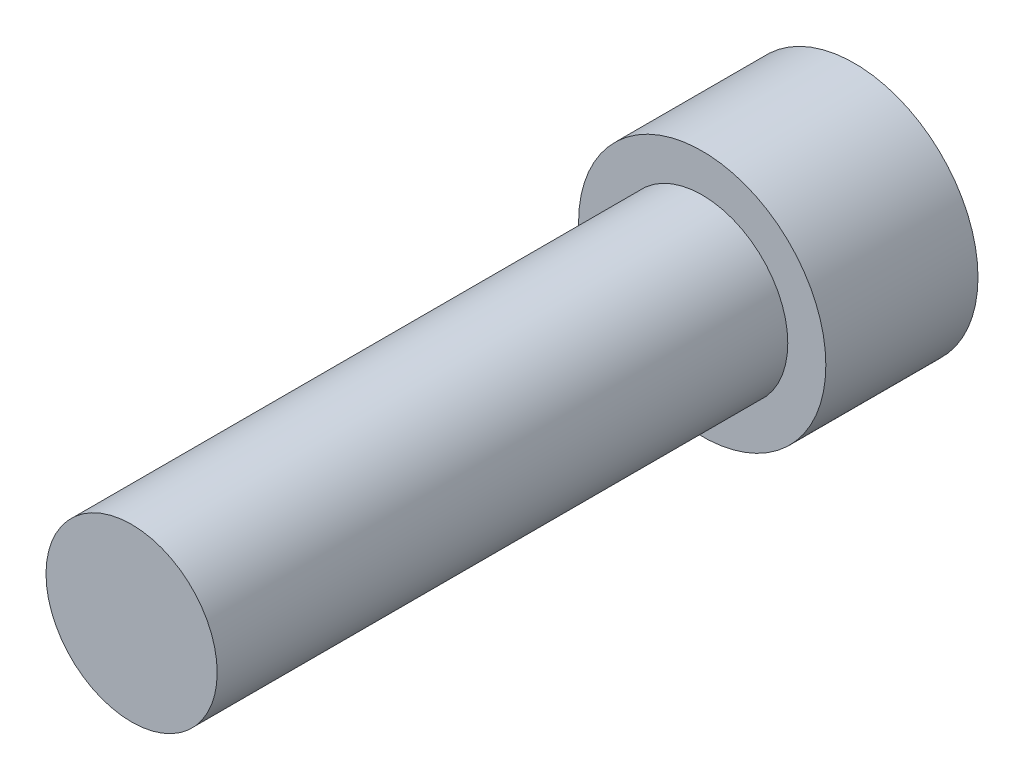
ISO-10303-21;
HEADER;
FILE_DESCRIPTION(('STEP AP214'),'2;1');
FILE_NAME('part.step','',(''),(''),'','','');
FILE_SCHEMA(('AUTOMOTIVE_DESIGN { 1 0 10303 214 1 1 1 1 }'));
ENDSEC;
DATA;
#1=APPLICATION_CONTEXT('core data for automotive mechanical design processes');
#2=APPLICATION_PROTOCOL_DEFINITION('international standard','automotive_design',2000,#1);
#3=PRODUCT_CONTEXT('',#1,'mechanical');
#4=PRODUCT('Part','Part','',(#3));
#5=PRODUCT_RELATED_PRODUCT_CATEGORY('part','',(#4));
#6=PRODUCT_DEFINITION_FORMATION('','',#4);
#7=PRODUCT_DEFINITION_CONTEXT('part definition',#1,'design');
#8=PRODUCT_DEFINITION('design','',#6,#7);
#9=PRODUCT_DEFINITION_SHAPE('','',#8);
#10=(LENGTH_UNIT() NAMED_UNIT(*) SI_UNIT(.MILLI.,.METRE.));
#11=(NAMED_UNIT(*) PLANE_ANGLE_UNIT() SI_UNIT($,.RADIAN.));
#12=(NAMED_UNIT(*) SI_UNIT($,.STERADIAN.) SOLID_ANGLE_UNIT());
#13=UNCERTAINTY_MEASURE_WITH_UNIT(LENGTH_MEASURE(1.E-05),#10,'distance_accuracy_value','');
#14=(GEOMETRIC_REPRESENTATION_CONTEXT(3) GLOBAL_UNCERTAINTY_ASSIGNED_CONTEXT((#13)) GLOBAL_UNIT_ASSIGNED_CONTEXT((#10,
#11,#12)) REPRESENTATION_CONTEXT('',''));
#15=CARTESIAN_POINT('',(0.,0.,0.));
#16=DIRECTION('',(0.,0.,1.));
#17=DIRECTION('',(1.,0.,0.));
#18=AXIS2_PLACEMENT_3D('',#15,#16,#17);
#19=CARTESIAN_POINT('',(0.,0.,30.));
#20=DIRECTION('',(0.,0.,-1.));
#21=DIRECTION('',(-1.,0.,0.));
#22=AXIS2_PLACEMENT_3D('',#19,#20,#21);
#23=CYLINDRICAL_SURFACE('',#22,4.5);
#24=CARTESIAN_POINT('',(0.,0.,30.));
#25=DIRECTION('',(0.,0.,1.));
#26=DIRECTION('',(1.,0.,0.));
#27=AXIS2_PLACEMENT_3D('',#24,#25,#26);
#28=CIRCLE('',#27,4.5);
#29=CARTESIAN_POINT('',(4.5,0.,30.));
#30=VERTEX_POINT('',#29);
#31=EDGE_CURVE('E11',#30,#30,#28,.T.);
#32=ORIENTED_EDGE('',*,*,#31,.F.);
#33=EDGE_LOOP('',(#32));
#34=FACE_BOUND('',#33,.T.);
#35=CARTESIAN_POINT('',(0.,0.,0.));
#36=DIRECTION('',(0.,0.,1.));
#37=DIRECTION('',(1.,0.,0.));
#38=AXIS2_PLACEMENT_3D('',#35,#36,#37);
#39=CIRCLE('',#38,4.5);
#40=CARTESIAN_POINT('',(4.5,0.,0.));
#41=VERTEX_POINT('',#40);
#42=EDGE_CURVE('E46',#41,#41,#39,.T.);
#43=ORIENTED_EDGE('',*,*,#42,.T.);
#44=EDGE_LOOP('',(#43));
#45=FACE_BOUND('',#44,.T.);
#46=ADVANCED_FACE('F43',(#34,#45),#23,.T.);
#47=CARTESIAN_POINT('',(0.,0.,30.));
#48=DIRECTION('',(0.,0.,1.));
#49=DIRECTION('',(1.,0.,0.));
#50=AXIS2_PLACEMENT_3D('',#47,#48,#49);
#51=PLANE('',#50);
#52=ORIENTED_EDGE('',*,*,#31,.T.);
#53=EDGE_LOOP('',(#52));
#54=FACE_BOUND('',#53,.T.);
#55=ADVANCED_FACE('F241',(#54),#51,.T.);
#56=CARTESIAN_POINT('',(0.,0.,-8.));
#57=DIRECTION('',(0.,0.,1.));
#58=DIRECTION('',(1.,0.,0.));
#59=AXIS2_PLACEMENT_3D('',#56,#57,#58);
#60=CYLINDRICAL_SURFACE('',#59,6.5);
#61=CARTESIAN_POINT('',(0.,0.,-8.));
#62=DIRECTION('',(0.,0.,-1.));
#63=DIRECTION('',(-1.,0.,0.));
#64=AXIS2_PLACEMENT_3D('',#61,#62,#63);
#65=CIRCLE('',#64,6.5);
#66=CARTESIAN_POINT('',(-6.5,0.,-8.));
#67=VERTEX_POINT('',#66);
#68=EDGE_CURVE('E216',#67,#67,#65,.T.);
#69=ORIENTED_EDGE('',*,*,#68,.F.);
#70=EDGE_LOOP('',(#69));
#71=FACE_BOUND('',#70,.T.);
#72=CARTESIAN_POINT('',(0.,0.,0.));
#73=DIRECTION('',(0.,0.,-1.));
#74=DIRECTION('',(-1.,0.,0.));
#75=AXIS2_PLACEMENT_3D('',#72,#73,#74);
#76=CIRCLE('',#75,6.5);
#77=CARTESIAN_POINT('',(-6.5,0.,0.));
#78=VERTEX_POINT('',#77);
#79=EDGE_CURVE('E198',#78,#78,#76,.T.);
#80=ORIENTED_EDGE('',*,*,#79,.T.);
#81=EDGE_LOOP('',(#80));
#82=FACE_BOUND('',#81,.T.);
#83=ADVANCED_FACE('F222',(#71,#82),#60,.T.);
#84=CARTESIAN_POINT('',(0.,0.,-8.));
#85=DIRECTION('',(0.,0.,-1.));
#86=DIRECTION('',(-1.,0.,0.));
#87=AXIS2_PLACEMENT_3D('',#84,#85,#86);
#88=PLANE('',#87);
#89=CARTESIAN_POINT('',(1.09157532982501,2.03514044543632,-8.));
#90=DIRECTION('',(0.,0.,-1.));
#91=DIRECTION('',(-1.,0.,0.));
#92=AXIS2_PLACEMENT_3D('',#89,#90,#91);
#93=CIRCLE('',#92,0.5);
#94=CARTESIAN_POINT('',(1.07593528841507,2.53489577467724,-8.));
#95=VERTEX_POINT('',#94);
#96=CARTESIAN_POINT('',(1.51655611991933,2.29856278323403,-8.));
#97=VERTEX_POINT('',#96);
#98=EDGE_CURVE('E57',#95,#97,#93,.T.);
#99=ORIENTED_EDGE('',*,*,#98,.F.);
#100=DIRECTION('',(0.99951065848183,0.0312800828198786,0.));
#101=VECTOR('',#100,1.);
#102=CARTESIAN_POINT('',(-1.23233570251446,2.46265751773191,-8.));
#103=LINE('',#102,#101);
#104=CARTESIAN_POINT('',(-1.23233570251446,2.46265751773191,-8.));
#105=VERTEX_POINT('',#104);
#106=EDGE_CURVE('E194',#105,#95,#103,.T.);
#107=ORIENTED_EDGE('',*,*,#106,.F.);
#108=CARTESIAN_POINT('',(-1.21669566110453,1.962902188491,-8.));
#109=DIRECTION('',(0.,0.,-1.));
#110=DIRECTION('',(-1.,0.,0.));
#111=AXIS2_PLACEMENT_3D('',#108,#109,#110);
#112=CIRCLE('',#111,0.5);
#113=CARTESIAN_POINT('',(-1.65731649260879,2.19923517993421,-8.));
#114=VERTEX_POINT('',#113);
#115=EDGE_CURVE('E192',#114,#105,#112,.T.);
#116=ORIENTED_EDGE('',*,*,#115,.F.);
#117=DIRECTION('',(0.472665982886419,0.881241663008516,0.));
#118=VECTOR('',#117,1.);
#119=CARTESIAN_POINT('',(-2.7488918224338,0.164094734497888,-8.));
#120=LINE('',#119,#118);
#121=CARTESIAN_POINT('',(-2.7488918224338,0.164094734497888,-8.));
#122=VERTEX_POINT('',#121);
#123=EDGE_CURVE('E141',#122,#114,#120,.T.);
#124=ORIENTED_EDGE('',*,*,#123,.F.);
#125=CARTESIAN_POINT('',(-2.30827099092954,-0.0722382569453232,-8.));
#126=DIRECTION('',(0.,0.,-1.));
#127=DIRECTION('',(-1.,0.,0.));
#128=AXIS2_PLACEMENT_3D('',#125,#126,#127);
#129=CIRCLE('',#128,0.5);
#130=CARTESIAN_POINT('',(-2.73325178102386,-0.335660594743031,-8.));
#131=VERTEX_POINT('',#130);
#132=EDGE_CURVE('E188',#131,#122,#129,.T.);
#133=ORIENTED_EDGE('',*,*,#132,.F.);
#134=DIRECTION('',(-0.526844675595411,0.849961580188638,0.));
#135=VECTOR('',#134,1.);
#136=CARTESIAN_POINT('',(-1.51655611991933,-2.29856278323403,-8.));
#137=LINE('',#136,#135);
#138=CARTESIAN_POINT('',(-1.51655611991933,-2.29856278323403,-8.));
#139=VERTEX_POINT('',#138);
#140=EDGE_CURVE('E185',#139,#131,#137,.T.);
#141=ORIENTED_EDGE('',*,*,#140,.F.);
#142=CARTESIAN_POINT('',(-1.09157532982501,-2.03514044543632,-8.));
#143=DIRECTION('',(0.,0.,-1.));
#144=DIRECTION('',(1.,0.,0.));
#145=AXIS2_PLACEMENT_3D('',#142,#143,#144);
#146=CIRCLE('',#145,0.5);
#147=CARTESIAN_POINT('',(-1.07593528841507,-2.53489577467724,-8.));
#148=VERTEX_POINT('',#147);
#149=EDGE_CURVE('E182',#148,#139,#146,.T.);
#150=ORIENTED_EDGE('',*,*,#149,.F.);
#151=DIRECTION('',(-0.99951065848183,-0.0312800828198786,0.));
#152=VECTOR('',#151,1.);
#153=CARTESIAN_POINT('',(1.23233570251446,-2.46265751773191,-8.));
#154=LINE('',#153,#152);
#155=CARTESIAN_POINT('',(1.23233570251446,-2.46265751773191,-8.));
#156=VERTEX_POINT('',#155);
#157=EDGE_CURVE('E179',#156,#148,#154,.T.);
#158=ORIENTED_EDGE('',*,*,#157,.F.);
#159=CARTESIAN_POINT('',(1.21669566110453,-1.962902188491,-8.));
#160=DIRECTION('',(0.,0.,-1.));
#161=DIRECTION('',(-1.,0.,0.));
#162=AXIS2_PLACEMENT_3D('',#159,#160,#161);
#163=CIRCLE('',#162,0.5);
#164=CARTESIAN_POINT('',(1.65731649260879,-2.19923517993421,-8.));
#165=VERTEX_POINT('',#164);
#166=EDGE_CURVE('E176',#165,#156,#163,.T.);
#167=ORIENTED_EDGE('',*,*,#166,.F.);
#168=DIRECTION('',(-0.472665982886419,-0.881241663008516,0.));
#169=VECTOR('',#168,1.);
#170=CARTESIAN_POINT('',(2.7488918224338,-0.164094734497889,-8.));
#171=LINE('',#170,#169);
#172=CARTESIAN_POINT('',(2.7488918224338,-0.164094734497889,-8.));
#173=VERTEX_POINT('',#172);
#174=EDGE_CURVE('E173',#173,#165,#171,.T.);
#175=ORIENTED_EDGE('',*,*,#174,.F.);
#176=CARTESIAN_POINT('',(2.30827099092954,0.0722382569453228,-8.));
#177=DIRECTION('',(0.,0.,-1.));
#178=DIRECTION('',(-1.,0.,0.));
#179=AXIS2_PLACEMENT_3D('',#176,#177,#178);
#180=CIRCLE('',#179,0.5);
#181=CARTESIAN_POINT('',(2.73325178102386,0.33566059474303,-8.));
#182=VERTEX_POINT('',#181);
#183=EDGE_CURVE('E170',#182,#173,#180,.T.);
#184=ORIENTED_EDGE('',*,*,#183,.F.);
#185=DIRECTION('',(0.526844675595411,-0.849961580188638,0.));
#186=VECTOR('',#185,1.);
#187=CARTESIAN_POINT('',(1.51655611991933,2.29856278323403,-8.));
#188=LINE('',#187,#186);
#189=EDGE_CURVE('E167',#97,#182,#188,.T.);
#190=ORIENTED_EDGE('',*,*,#189,.F.);
#191=EDGE_LOOP('',(#99,#107,#116,#124,#133,#141,#150,#158,#167,#175,#184,#190));
#192=FACE_BOUND('',#191,.T.);
#193=ORIENTED_EDGE('',*,*,#68,.T.);
#194=EDGE_LOOP('',(#193));
#195=FACE_BOUND('',#194,.T.);
#196=ADVANCED_FACE('F227',(#192,#195),#88,.T.);
#197=CARTESIAN_POINT('',(0.,0.,0.));
#198=DIRECTION('',(0.,0.,-1.));
#199=DIRECTION('',(-1.,0.,0.));
#200=AXIS2_PLACEMENT_3D('',#197,#198,#199);
#201=PLANE('',#200);
#202=ORIENTED_EDGE('',*,*,#42,.F.);
#203=EDGE_LOOP('',(#202));
#204=FACE_BOUND('',#203,.T.);
#205=ORIENTED_EDGE('',*,*,#79,.F.);
#206=EDGE_LOOP('',(#205));
#207=FACE_BOUND('',#206,.T.);
#208=ADVANCED_FACE('F224',(#204,#207),#201,.F.);
#209=CARTESIAN_POINT('',(1.09157532982501,2.03514044543632,-4.));
#210=DIRECTION('',(0.,0.,-1.));
#211=DIRECTION('',(-1.,0.,0.));
#212=AXIS2_PLACEMENT_3D('',#209,#210,#211);
#213=CYLINDRICAL_SURFACE('',#212,0.5);
#214=ORIENTED_EDGE('',*,*,#98,.T.);
#215=DIRECTION('',(0.,0.,-1.));
#216=VECTOR('',#215,1.);
#217=CARTESIAN_POINT('',(1.51655611991933,2.29856278323403,-4.));
#218=LINE('',#217,#216);
#219=CARTESIAN_POINT('',(1.51655611991933,2.29856278323403,-4.));
#220=VERTEX_POINT('',#219);
#221=EDGE_CURVE('E105',#220,#97,#218,.T.);
#222=ORIENTED_EDGE('',*,*,#221,.F.);
#223=CARTESIAN_POINT('',(1.09157532982501,2.03514044543632,-4.));
#224=DIRECTION('',(0.,0.,-1.));
#225=DIRECTION('',(-1.,0.,0.));
#226=AXIS2_PLACEMENT_3D('',#223,#224,#225);
#227=CIRCLE('',#226,0.5);
#228=CARTESIAN_POINT('',(1.07593528841507,2.53489577467724,-4.));
#229=VERTEX_POINT('',#228);
#230=EDGE_CURVE('E196',#229,#220,#227,.T.);
#231=ORIENTED_EDGE('',*,*,#230,.F.);
#232=DIRECTION('',(0.,0.,-1.));
#233=VECTOR('',#232,1.);
#234=CARTESIAN_POINT('',(1.07593528841507,2.53489577467724,-4.));
#235=LINE('',#234,#233);
#236=EDGE_CURVE('E65',#229,#95,#235,.T.);
#237=ORIENTED_EDGE('',*,*,#236,.T.);
#238=EDGE_LOOP('',(#214,#222,#231,#237));
#239=FACE_BOUND('',#238,.T.);
#240=ADVANCED_FACE('F226',(#239),#213,.F.);
#241=CARTESIAN_POINT('',(-1.23233570251446,2.46265751773191,-4.));
#242=DIRECTION('',(-0.0312800828198786,0.99951065848183,0.));
#243=DIRECTION('',(-0.99951065848183,-0.0312800828198786,0.));
#244=AXIS2_PLACEMENT_3D('',#241,#242,#243);
#245=PLANE('',#244);
#246=ORIENTED_EDGE('',*,*,#106,.T.);
#247=ORIENTED_EDGE('',*,*,#236,.F.);
#248=DIRECTION('',(0.99951065848183,0.0312800828198786,0.));
#249=VECTOR('',#248,1.);
#250=CARTESIAN_POINT('',(-1.23233570251446,2.46265751773191,-4.));
#251=LINE('',#250,#249);
#252=CARTESIAN_POINT('',(-1.23233570251446,2.46265751773191,-4.));
#253=VERTEX_POINT('',#252);
#254=EDGE_CURVE('E153',#253,#229,#251,.T.);
#255=ORIENTED_EDGE('',*,*,#254,.F.);
#256=DIRECTION('',(0.,0.,-1.));
#257=VECTOR('',#256,1.);
#258=CARTESIAN_POINT('',(-1.23233570251446,2.46265751773191,-4.));
#259=LINE('',#258,#257);
#260=EDGE_CURVE('E145',#253,#105,#259,.T.);
#261=ORIENTED_EDGE('',*,*,#260,.T.);
#262=EDGE_LOOP('',(#246,#247,#255,#261));
#263=FACE_BOUND('',#262,.T.);
#264=ADVANCED_FACE('F234',(#263),#245,.F.);
#265=CARTESIAN_POINT('',(-1.21669566110453,1.962902188491,-4.));
#266=DIRECTION('',(0.,0.,-1.));
#267=DIRECTION('',(-1.,0.,0.));
#268=AXIS2_PLACEMENT_3D('',#265,#266,#267);
#269=CYLINDRICAL_SURFACE('',#268,0.5);
#270=ORIENTED_EDGE('',*,*,#115,.T.);
#271=ORIENTED_EDGE('',*,*,#260,.F.);
#272=CARTESIAN_POINT('',(-1.21669566110453,1.962902188491,-4.));
#273=DIRECTION('',(0.,0.,-1.));
#274=DIRECTION('',(-1.,0.,0.));
#275=AXIS2_PLACEMENT_3D('',#272,#273,#274);
#276=CIRCLE('',#275,0.5);
#277=CARTESIAN_POINT('',(-1.65731649260879,2.19923517993421,-4.));
#278=VERTEX_POINT('',#277);
#279=EDGE_CURVE('E149',#278,#253,#276,.T.);
#280=ORIENTED_EDGE('',*,*,#279,.F.);
#281=DIRECTION('',(0.,0.,-1.));
#282=VECTOR('',#281,1.);
#283=CARTESIAN_POINT('',(-1.65731649260879,2.19923517993421,-4.));
#284=LINE('',#283,#282);
#285=EDGE_CURVE('E134',#278,#114,#284,.T.);
#286=ORIENTED_EDGE('',*,*,#285,.T.);
#287=EDGE_LOOP('',(#270,#271,#280,#286));
#288=FACE_BOUND('',#287,.T.);
#289=ADVANCED_FACE('F150',(#288),#269,.F.);
#290=CARTESIAN_POINT('',(-2.7488918224338,0.164094734497888,-4.));
#291=DIRECTION('',(-0.881241663008516,0.472665982886419,0.));
#292=DIRECTION('',(-0.472665982886419,-0.881241663008516,0.));
#293=AXIS2_PLACEMENT_3D('',#290,#291,#292);
#294=PLANE('',#293);
#295=ORIENTED_EDGE('',*,*,#123,.T.);
#296=ORIENTED_EDGE('',*,*,#285,.F.);
#297=DIRECTION('',(0.472665982886419,0.881241663008516,0.));
#298=VECTOR('',#297,1.);
#299=CARTESIAN_POINT('',(-2.7488918224338,0.164094734497888,-4.));
#300=LINE('',#299,#298);
#301=CARTESIAN_POINT('',(-2.7488918224338,0.164094734497888,-4.));
#302=VERTEX_POINT('',#301);
#303=EDGE_CURVE('E138',#302,#278,#300,.T.);
#304=ORIENTED_EDGE('',*,*,#303,.F.);
#305=DIRECTION('',(0.,0.,-1.));
#306=VECTOR('',#305,1.);
#307=CARTESIAN_POINT('',(-2.7488918224338,0.164094734497888,-4.));
#308=LINE('',#307,#306);
#309=EDGE_CURVE('E146',#302,#122,#308,.T.);
#310=ORIENTED_EDGE('',*,*,#309,.T.);
#311=EDGE_LOOP('',(#295,#296,#304,#310));
#312=FACE_BOUND('',#311,.T.);
#313=ADVANCED_FACE('F136',(#312),#294,.F.);
#314=CARTESIAN_POINT('',(-2.30827099092954,-0.0722382569453232,-4.));
#315=DIRECTION('',(0.,0.,-1.));
#316=DIRECTION('',(-1.,0.,0.));
#317=AXIS2_PLACEMENT_3D('',#314,#315,#316);
#318=CYLINDRICAL_SURFACE('',#317,0.5);
#319=ORIENTED_EDGE('',*,*,#132,.T.);
#320=ORIENTED_EDGE('',*,*,#309,.F.);
#321=CARTESIAN_POINT('',(-2.30827099092954,-0.0722382569453232,-4.));
#322=DIRECTION('',(0.,0.,-1.));
#323=DIRECTION('',(-1.,0.,0.));
#324=AXIS2_PLACEMENT_3D('',#321,#322,#323);
#325=CIRCLE('',#324,0.5);
#326=CARTESIAN_POINT('',(-2.73325178102386,-0.335660594743031,-4.));
#327=VERTEX_POINT('',#326);
#328=EDGE_CURVE('E159',#327,#302,#325,.T.);
#329=ORIENTED_EDGE('',*,*,#328,.F.);
#330=DIRECTION('',(0.,0.,-1.));
#331=VECTOR('',#330,1.);
#332=CARTESIAN_POINT('',(-2.73325178102386,-0.335660594743031,-4.));
#333=LINE('',#332,#331);
#334=EDGE_CURVE('E201',#327,#131,#333,.T.);
#335=ORIENTED_EDGE('',*,*,#334,.T.);
#336=EDGE_LOOP('',(#319,#320,#329,#335));
#337=FACE_BOUND('',#336,.T.);
#338=ADVANCED_FACE('F299',(#337),#318,.F.);
#339=CARTESIAN_POINT('',(-1.51655611991933,-2.29856278323403,-4.));
#340=DIRECTION('',(-0.849961580188638,-0.526844675595411,0.));
#341=DIRECTION('',(0.526844675595411,-0.849961580188638,0.));
#342=AXIS2_PLACEMENT_3D('',#339,#340,#341);
#343=PLANE('',#342);
#344=ORIENTED_EDGE('',*,*,#140,.T.);
#345=ORIENTED_EDGE('',*,*,#334,.F.);
#346=DIRECTION('',(-0.526844675595411,0.849961580188638,0.));
#347=VECTOR('',#346,1.);
#348=CARTESIAN_POINT('',(-1.51655611991933,-2.29856278323403,-4.));
#349=LINE('',#348,#347);
#350=CARTESIAN_POINT('',(-1.51655611991933,-2.29856278323403,-4.));
#351=VERTEX_POINT('',#350);
#352=EDGE_CURVE('E161',#351,#327,#349,.T.);
#353=ORIENTED_EDGE('',*,*,#352,.F.);
#354=DIRECTION('',(0.,0.,-1.));
#355=VECTOR('',#354,1.);
#356=CARTESIAN_POINT('',(-1.51655611991933,-2.29856278323403,-4.));
#357=LINE('',#356,#355);
#358=EDGE_CURVE('E203',#351,#139,#357,.T.);
#359=ORIENTED_EDGE('',*,*,#358,.T.);
#360=EDGE_LOOP('',(#344,#345,#353,#359));
#361=FACE_BOUND('',#360,.T.);
#362=ADVANCED_FACE('F309',(#361),#343,.F.);
#363=CARTESIAN_POINT('',(-1.09157532982501,-2.03514044543632,-4.));
#364=DIRECTION('',(0.,0.,-1.));
#365=DIRECTION('',(-1.,0.,0.));
#366=AXIS2_PLACEMENT_3D('',#363,#364,#365);
#367=CYLINDRICAL_SURFACE('',#366,0.5);
#368=ORIENTED_EDGE('',*,*,#149,.T.);
#369=ORIENTED_EDGE('',*,*,#358,.F.);
#370=CARTESIAN_POINT('',(-1.09157532982501,-2.03514044543632,-4.));
#371=DIRECTION('',(0.,0.,-1.));
#372=DIRECTION('',(1.,0.,0.));
#373=AXIS2_PLACEMENT_3D('',#370,#371,#372);
#374=CIRCLE('',#373,0.5);
#375=CARTESIAN_POINT('',(-1.07593528841507,-2.53489577467724,-4.));
#376=VERTEX_POINT('',#375);
#377=EDGE_CURVE('E457',#376,#351,#374,.T.);
#378=ORIENTED_EDGE('',*,*,#377,.F.);
#379=DIRECTION('',(0.,0.,-1.));
#380=VECTOR('',#379,1.);
#381=CARTESIAN_POINT('',(-1.07593528841507,-2.53489577467724,-4.));
#382=LINE('',#381,#380);
#383=EDGE_CURVE('E205',#376,#148,#382,.T.);
#384=ORIENTED_EDGE('',*,*,#383,.T.);
#385=EDGE_LOOP('',(#368,#369,#378,#384));
#386=FACE_BOUND('',#385,.T.);
#387=ADVANCED_FACE('F320',(#386),#367,.F.);
#388=CARTESIAN_POINT('',(1.23233570251446,-2.46265751773191,-4.));
#389=DIRECTION('',(0.0312800828198786,-0.99951065848183,0.));
#390=DIRECTION('',(0.99951065848183,0.0312800828198786,0.));
#391=AXIS2_PLACEMENT_3D('',#388,#389,#390);
#392=PLANE('',#391);
#393=ORIENTED_EDGE('',*,*,#157,.T.);
#394=ORIENTED_EDGE('',*,*,#383,.F.);
#395=DIRECTION('',(-0.99951065848183,-0.0312800828198786,0.));
#396=VECTOR('',#395,1.);
#397=CARTESIAN_POINT('',(1.23233570251446,-2.46265751773191,-4.));
#398=LINE('',#397,#396);
#399=CARTESIAN_POINT('',(1.23233570251446,-2.46265751773191,-4.));
#400=VERTEX_POINT('',#399);
#401=EDGE_CURVE('E454',#400,#376,#398,.T.);
#402=ORIENTED_EDGE('',*,*,#401,.F.);
#403=DIRECTION('',(0.,0.,-1.));
#404=VECTOR('',#403,1.);
#405=CARTESIAN_POINT('',(1.23233570251446,-2.46265751773191,-4.));
#406=LINE('',#405,#404);
#407=EDGE_CURVE('E207',#400,#156,#406,.T.);
#408=ORIENTED_EDGE('',*,*,#407,.T.);
#409=EDGE_LOOP('',(#393,#394,#402,#408));
#410=FACE_BOUND('',#409,.T.);
#411=ADVANCED_FACE('F331',(#410),#392,.F.);
#412=CARTESIAN_POINT('',(1.21669566110453,-1.962902188491,-4.));
#413=DIRECTION('',(0.,0.,-1.));
#414=DIRECTION('',(-1.,0.,0.));
#415=AXIS2_PLACEMENT_3D('',#412,#413,#414);
#416=CYLINDRICAL_SURFACE('',#415,0.5);
#417=ORIENTED_EDGE('',*,*,#166,.T.);
#418=ORIENTED_EDGE('',*,*,#407,.F.);
#419=CARTESIAN_POINT('',(1.21669566110453,-1.962902188491,-4.));
#420=DIRECTION('',(0.,0.,-1.));
#421=DIRECTION('',(-1.,0.,0.));
#422=AXIS2_PLACEMENT_3D('',#419,#420,#421);
#423=CIRCLE('',#422,0.5);
#424=CARTESIAN_POINT('',(1.65731649260879,-2.19923517993421,-4.));
#425=VERTEX_POINT('',#424);
#426=EDGE_CURVE('E451',#425,#400,#423,.T.);
#427=ORIENTED_EDGE('',*,*,#426,.F.);
#428=DIRECTION('',(0.,0.,-1.));
#429=VECTOR('',#428,1.);
#430=CARTESIAN_POINT('',(1.65731649260879,-2.19923517993421,-4.));
#431=LINE('',#430,#429);
#432=EDGE_CURVE('E209',#425,#165,#431,.T.);
#433=ORIENTED_EDGE('',*,*,#432,.T.);
#434=EDGE_LOOP('',(#417,#418,#427,#433));
#435=FACE_BOUND('',#434,.T.);
#436=ADVANCED_FACE('F342',(#435),#416,.F.);
#437=CARTESIAN_POINT('',(2.7488918224338,-0.164094734497889,-4.));
#438=DIRECTION('',(0.881241663008516,-0.472665982886419,0.));
#439=DIRECTION('',(0.472665982886419,0.881241663008516,0.));
#440=AXIS2_PLACEMENT_3D('',#437,#438,#439);
#441=PLANE('',#440);
#442=ORIENTED_EDGE('',*,*,#174,.T.);
#443=ORIENTED_EDGE('',*,*,#432,.F.);
#444=DIRECTION('',(-0.472665982886419,-0.881241663008516,0.));
#445=VECTOR('',#444,1.);
#446=CARTESIAN_POINT('',(2.7488918224338,-0.164094734497889,-4.));
#447=LINE('',#446,#445);
#448=CARTESIAN_POINT('',(2.7488918224338,-0.164094734497889,-4.));
#449=VERTEX_POINT('',#448);
#450=EDGE_CURVE('E444',#449,#425,#447,.T.);
#451=ORIENTED_EDGE('',*,*,#450,.F.);
#452=DIRECTION('',(0.,0.,-1.));
#453=VECTOR('',#452,1.);
#454=CARTESIAN_POINT('',(2.7488918224338,-0.164094734497889,-4.));
#455=LINE('',#454,#453);
#456=EDGE_CURVE('E211',#449,#173,#455,.T.);
#457=ORIENTED_EDGE('',*,*,#456,.T.);
#458=EDGE_LOOP('',(#442,#443,#451,#457));
#459=FACE_BOUND('',#458,.T.);
#460=ADVANCED_FACE('F353',(#459),#441,.F.);
#461=CARTESIAN_POINT('',(2.30827099092954,0.0722382569453228,-4.));
#462=DIRECTION('',(0.,0.,-1.));
#463=DIRECTION('',(-1.,0.,0.));
#464=AXIS2_PLACEMENT_3D('',#461,#462,#463);
#465=CYLINDRICAL_SURFACE('',#464,0.5);
#466=ORIENTED_EDGE('',*,*,#183,.T.);
#467=ORIENTED_EDGE('',*,*,#456,.F.);
#468=CARTESIAN_POINT('',(2.30827099092954,0.0722382569453228,-4.));
#469=DIRECTION('',(0.,0.,-1.));
#470=DIRECTION('',(-1.,0.,0.));
#471=AXIS2_PLACEMENT_3D('',#468,#469,#470);
#472=CIRCLE('',#471,0.5);
#473=CARTESIAN_POINT('',(2.73325178102386,0.33566059474303,-4.));
#474=VERTEX_POINT('',#473);
#475=EDGE_CURVE('E441',#474,#449,#472,.T.);
#476=ORIENTED_EDGE('',*,*,#475,.F.);
#477=DIRECTION('',(0.,0.,-1.));
#478=VECTOR('',#477,1.);
#479=CARTESIAN_POINT('',(2.73325178102386,0.33566059474303,-4.));
#480=LINE('',#479,#478);
#481=EDGE_CURVE('E213',#474,#182,#480,.T.);
#482=ORIENTED_EDGE('',*,*,#481,.T.);
#483=EDGE_LOOP('',(#466,#467,#476,#482));
#484=FACE_BOUND('',#483,.T.);
#485=ADVANCED_FACE('F364',(#484),#465,.F.);
#486=CARTESIAN_POINT('',(1.51655611991933,2.29856278323403,-4.));
#487=DIRECTION('',(0.849961580188638,0.526844675595411,0.));
#488=DIRECTION('',(-0.526844675595411,0.849961580188638,0.));
#489=AXIS2_PLACEMENT_3D('',#486,#487,#488);
#490=PLANE('',#489);
#491=ORIENTED_EDGE('',*,*,#189,.T.);
#492=ORIENTED_EDGE('',*,*,#481,.F.);
#493=DIRECTION('',(0.526844675595411,-0.849961580188638,0.));
#494=VECTOR('',#493,1.);
#495=CARTESIAN_POINT('',(1.51655611991933,2.29856278323403,-4.));
#496=LINE('',#495,#494);
#497=EDGE_CURVE('E445',#220,#474,#496,.T.);
#498=ORIENTED_EDGE('',*,*,#497,.F.);
#499=ORIENTED_EDGE('',*,*,#221,.T.);
#500=EDGE_LOOP('',(#491,#492,#498,#499));
#501=FACE_BOUND('',#500,.T.);
#502=ADVANCED_FACE('F375',(#501),#490,.F.);
#503=CARTESIAN_POINT('',(1.09157532982501,2.03514044543632,-4.));
#504=DIRECTION('',(0.,0.,-1.));
#505=DIRECTION('',(-1.,0.,0.));
#506=AXIS2_PLACEMENT_3D('',#503,#504,#505);
#507=PLANE('',#506);
#508=ORIENTED_EDGE('',*,*,#230,.T.);
#509=ORIENTED_EDGE('',*,*,#497,.T.);
#510=ORIENTED_EDGE('',*,*,#475,.T.);
#511=ORIENTED_EDGE('',*,*,#450,.T.);
#512=ORIENTED_EDGE('',*,*,#426,.T.);
#513=ORIENTED_EDGE('',*,*,#401,.T.);
#514=ORIENTED_EDGE('',*,*,#377,.T.);
#515=ORIENTED_EDGE('',*,*,#352,.T.);
#516=ORIENTED_EDGE('',*,*,#328,.T.);
#517=ORIENTED_EDGE('',*,*,#303,.T.);
#518=ORIENTED_EDGE('',*,*,#279,.T.);
#519=ORIENTED_EDGE('',*,*,#254,.T.);
#520=EDGE_LOOP('',(#508,#509,#510,#511,#512,#513,#514,#515,#516,#517,#518,#519));
#521=FACE_BOUND('',#520,.T.);
#522=ADVANCED_FACE('F156',(#521),#507,.T.);
#523=CLOSED_SHELL('',(#46,#55,#83,#196,#208,#240,#264,#289,#313,#338,#362,#387,#411,#436,#460,
#485,#502,#522));
#524=MANIFOLD_SOLID_BREP('B2',#523);
#525=ADVANCED_BREP_SHAPE_REPRESENTATION('',(#18,#524),#14);
#526=SHAPE_DEFINITION_REPRESENTATION(#9,#525);
ENDSEC;
END-ISO-10303-21;
